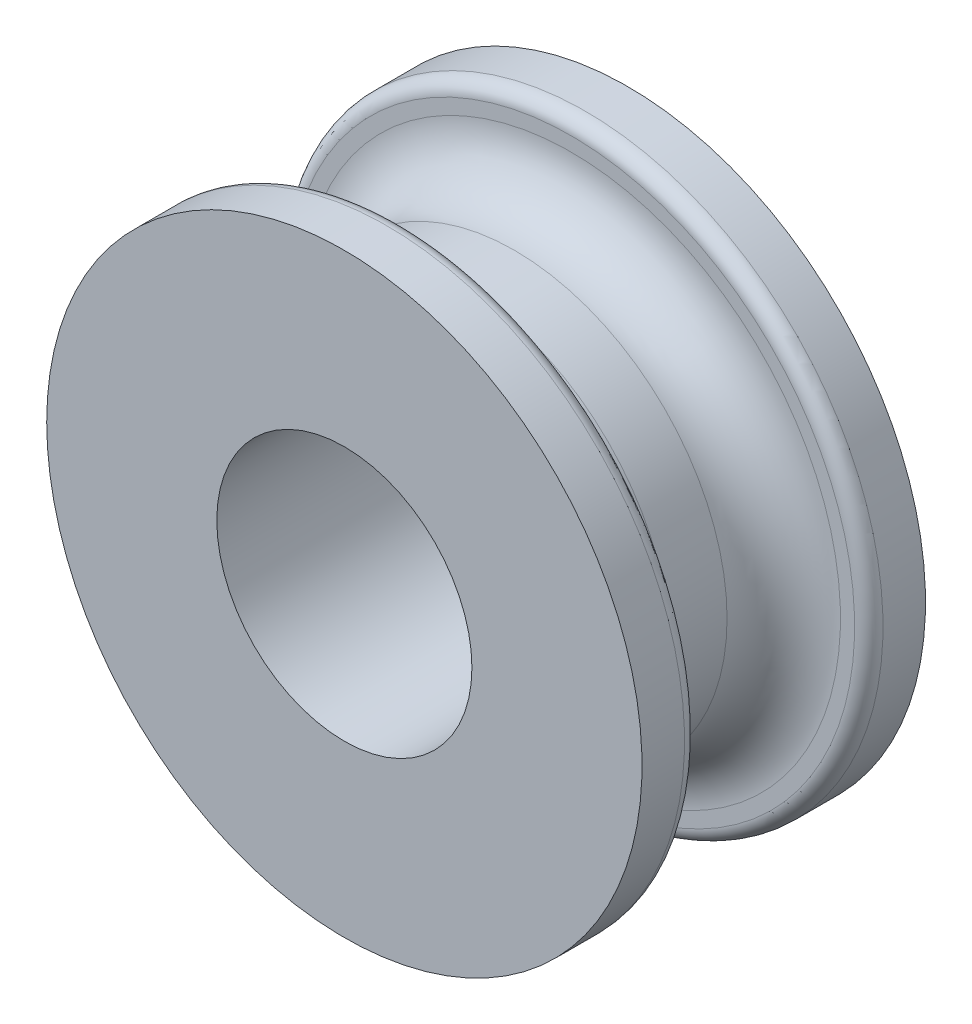
ISO-10303-21;
HEADER;
FILE_DESCRIPTION(('STEP AP214'),'2;1');
FILE_NAME('part.step','',(''),(''),'','','');
FILE_SCHEMA(('AUTOMOTIVE_DESIGN { 1 0 10303 214 1 1 1 1 }'));
ENDSEC;
DATA;
#1=APPLICATION_CONTEXT('core data for automotive mechanical design processes');
#2=APPLICATION_PROTOCOL_DEFINITION('international standard','automotive_design',2000,#1);
#3=PRODUCT_CONTEXT('',#1,'mechanical');
#4=PRODUCT('Part','Part','',(#3));
#5=PRODUCT_RELATED_PRODUCT_CATEGORY('part','',(#4));
#6=PRODUCT_DEFINITION_FORMATION('','',#4);
#7=PRODUCT_DEFINITION_CONTEXT('part definition',#1,'design');
#8=PRODUCT_DEFINITION('design','',#6,#7);
#9=PRODUCT_DEFINITION_SHAPE('','',#8);
#10=(LENGTH_UNIT() NAMED_UNIT(*) SI_UNIT(.MILLI.,.METRE.));
#11=(NAMED_UNIT(*) PLANE_ANGLE_UNIT() SI_UNIT($,.RADIAN.));
#12=(NAMED_UNIT(*) SI_UNIT($,.STERADIAN.) SOLID_ANGLE_UNIT());
#13=UNCERTAINTY_MEASURE_WITH_UNIT(LENGTH_MEASURE(1.E-05),#10,'distance_accuracy_value','');
#14=(GEOMETRIC_REPRESENTATION_CONTEXT(3) GLOBAL_UNCERTAINTY_ASSIGNED_CONTEXT((#13)) GLOBAL_UNIT_ASSIGNED_CONTEXT((#10,
#11,#12)) REPRESENTATION_CONTEXT('',''));
#15=CARTESIAN_POINT('',(0.,0.,0.));
#16=DIRECTION('',(0.,0.,1.));
#17=DIRECTION('',(1.,0.,0.));
#18=AXIS2_PLACEMENT_3D('',#15,#16,#17);
#19=CARTESIAN_POINT('',(0.,0.,-10.));
#20=DIRECTION('',(0.,0.,-1.));
#21=DIRECTION('',(-1.,0.,0.));
#22=AXIS2_PLACEMENT_3D('',#19,#20,#21);
#23=CYLINDRICAL_SURFACE('',#22,4.5);
#24=CARTESIAN_POINT('',(0.,0.,0.));
#25=DIRECTION('',(0.,0.,-1.));
#26=DIRECTION('',(-1.,0.,0.));
#27=AXIS2_PLACEMENT_3D('',#24,#25,#26);
#28=CIRCLE('',#27,4.5);
#29=CARTESIAN_POINT('',(-4.5,0.,0.));
#30=VERTEX_POINT('',#29);
#31=EDGE_CURVE('E10',#30,#30,#28,.T.);
#32=ORIENTED_EDGE('',*,*,#31,.F.);
#33=EDGE_LOOP('',(#32));
#34=FACE_BOUND('',#33,.T.);
#35=CARTESIAN_POINT('',(0.,0.,-10.));
#36=DIRECTION('',(0.,0.,-1.));
#37=DIRECTION('',(-1.,0.,0.));
#38=AXIS2_PLACEMENT_3D('',#35,#36,#37);
#39=CIRCLE('',#38,4.5);
#40=CARTESIAN_POINT('',(-4.5,0.,-10.));
#41=VERTEX_POINT('',#40);
#42=EDGE_CURVE('E88',#41,#41,#39,.T.);
#43=ORIENTED_EDGE('',*,*,#42,.T.);
#44=EDGE_LOOP('',(#43));
#45=FACE_BOUND('',#44,.T.);
#46=ADVANCED_FACE('F37',(#34,#45),#23,.F.);
#47=CARTESIAN_POINT('',(4.5,0.,0.));
#48=DIRECTION('',(0.,0.,-1.));
#49=DIRECTION('',(-1.,0.,0.));
#50=AXIS2_PLACEMENT_3D('',#47,#48,#49);
#51=PLANE('',#50);
#52=CARTESIAN_POINT('',(0.,0.,0.));
#53=DIRECTION('',(0.,0.,-1.));
#54=DIRECTION('',(-1.,0.,0.));
#55=AXIS2_PLACEMENT_3D('',#52,#53,#54);
#56=CIRCLE('',#55,10.5);
#57=CARTESIAN_POINT('',(-10.5,0.,0.));
#58=VERTEX_POINT('',#57);
#59=EDGE_CURVE('E44',#58,#58,#56,.T.);
#60=ORIENTED_EDGE('',*,*,#59,.F.);
#61=EDGE_LOOP('',(#60));
#62=FACE_BOUND('',#61,.T.);
#63=ORIENTED_EDGE('',*,*,#31,.T.);
#64=EDGE_LOOP('',(#63));
#65=FACE_BOUND('',#64,.T.);
#66=ADVANCED_FACE('F150',(#62,#65),#51,.F.);
#67=CARTESIAN_POINT('',(0.,0.,-10.));
#68=DIRECTION('',(0.,0.,-1.));
#69=DIRECTION('',(-1.,0.,0.));
#70=AXIS2_PLACEMENT_3D('',#67,#68,#69);
#71=CYLINDRICAL_SURFACE('',#70,10.5);
#72=CARTESIAN_POINT('',(0.,0.,-1.5));
#73=DIRECTION('',(0.,0.,-1.));
#74=DIRECTION('',(-1.,0.,0.));
#75=AXIS2_PLACEMENT_3D('',#72,#73,#74);
#76=CIRCLE('',#75,10.5);
#77=CARTESIAN_POINT('',(-10.5,0.,-1.5));
#78=VERTEX_POINT('',#77);
#79=EDGE_CURVE('E49',#78,#78,#76,.T.);
#80=ORIENTED_EDGE('',*,*,#79,.F.);
#81=EDGE_LOOP('',(#80));
#82=FACE_BOUND('',#81,.T.);
#83=ORIENTED_EDGE('',*,*,#59,.T.);
#84=EDGE_LOOP('',(#83));
#85=FACE_BOUND('',#84,.T.);
#86=ADVANCED_FACE('F145',(#82,#85),#71,.T.);
#87=CARTESIAN_POINT('',(0.,0.,-1.5));
#88=DIRECTION('',(0.,0.,-1.));
#89=DIRECTION('',(-1.,0.,0.));
#90=AXIS2_PLACEMENT_3D('',#87,#88,#89);
#91=TOROIDAL_SURFACE('',#90,10.,0.500000000000001);
#92=CARTESIAN_POINT('',(0.,0.,-2.));
#93=DIRECTION('',(0.,0.,-1.));
#94=DIRECTION('',(-1.,0.,0.));
#95=AXIS2_PLACEMENT_3D('',#92,#93,#94);
#96=CIRCLE('',#95,10.);
#97=CARTESIAN_POINT('',(-10.,0.,-2.));
#98=VERTEX_POINT('',#97);
#99=EDGE_CURVE('E54',#98,#98,#96,.T.);
#100=ORIENTED_EDGE('',*,*,#99,.F.);
#101=EDGE_LOOP('',(#100));
#102=FACE_BOUND('',#101,.T.);
#103=ORIENTED_EDGE('',*,*,#79,.T.);
#104=EDGE_LOOP('',(#103));
#105=FACE_BOUND('',#104,.T.);
#106=ADVANCED_FACE('F139',(#102,#105),#91,.T.);
#107=CARTESIAN_POINT('',(10.,0.,-2.));
#108=DIRECTION('',(0.,0.,1.));
#109=DIRECTION('',(1.,0.,0.));
#110=AXIS2_PLACEMENT_3D('',#107,#108,#109);
#111=PLANE('',#110);
#112=CARTESIAN_POINT('',(0.,0.,-2.));
#113=DIRECTION('',(0.,0.,-1.));
#114=DIRECTION('',(-1.,0.,0.));
#115=AXIS2_PLACEMENT_3D('',#112,#113,#114);
#116=CIRCLE('',#115,9.5);
#117=CARTESIAN_POINT('',(-9.5,0.,-2.));
#118=VERTEX_POINT('',#117);
#119=EDGE_CURVE('E60',#118,#118,#116,.T.);
#120=ORIENTED_EDGE('',*,*,#119,.F.);
#121=EDGE_LOOP('',(#120));
#122=FACE_BOUND('',#121,.T.);
#123=ORIENTED_EDGE('',*,*,#99,.T.);
#124=EDGE_LOOP('',(#123));
#125=FACE_BOUND('',#124,.T.);
#126=ADVANCED_FACE('F133',(#122,#125),#111,.F.);
#127=CARTESIAN_POINT('',(0.,0.,-4.));
#128=DIRECTION('',(0.,0.,-1.));
#129=DIRECTION('',(-1.,0.,0.));
#130=AXIS2_PLACEMENT_3D('',#127,#128,#129);
#131=TOROIDAL_SURFACE('',#130,9.5,2.);
#132=CARTESIAN_POINT('',(0.,0.,-4.));
#133=DIRECTION('',(0.,0.,-1.));
#134=DIRECTION('',(-1.,0.,0.));
#135=AXIS2_PLACEMENT_3D('',#132,#133,#134);
#136=CIRCLE('',#135,7.5);
#137=CARTESIAN_POINT('',(-7.5,0.,-4.));
#138=VERTEX_POINT('',#137);
#139=EDGE_CURVE('E64',#138,#138,#136,.T.);
#140=ORIENTED_EDGE('',*,*,#139,.F.);
#141=EDGE_LOOP('',(#140));
#142=FACE_BOUND('',#141,.T.);
#143=ORIENTED_EDGE('',*,*,#119,.T.);
#144=EDGE_LOOP('',(#143));
#145=FACE_BOUND('',#144,.T.);
#146=ADVANCED_FACE('F127',(#142,#145),#131,.F.);
#147=CARTESIAN_POINT('',(0.,0.,-10.));
#148=DIRECTION('',(0.,0.,-1.));
#149=DIRECTION('',(-1.,0.,0.));
#150=AXIS2_PLACEMENT_3D('',#147,#148,#149);
#151=CYLINDRICAL_SURFACE('',#150,7.5);
#152=CARTESIAN_POINT('',(0.,0.,-6.));
#153=DIRECTION('',(0.,0.,-1.));
#154=DIRECTION('',(-1.,0.,0.));
#155=AXIS2_PLACEMENT_3D('',#152,#153,#154);
#156=CIRCLE('',#155,7.5);
#157=CARTESIAN_POINT('',(-7.5,0.,-6.));
#158=VERTEX_POINT('',#157);
#159=EDGE_CURVE('E68',#158,#158,#156,.T.);
#160=ORIENTED_EDGE('',*,*,#159,.F.);
#161=EDGE_LOOP('',(#160));
#162=FACE_BOUND('',#161,.T.);
#163=ORIENTED_EDGE('',*,*,#139,.T.);
#164=EDGE_LOOP('',(#163));
#165=FACE_BOUND('',#164,.T.);
#166=ADVANCED_FACE('F121',(#162,#165),#151,.T.);
#167=CARTESIAN_POINT('',(0.,0.,-6.));
#168=DIRECTION('',(0.,0.,-1.));
#169=DIRECTION('',(-1.,0.,0.));
#170=AXIS2_PLACEMENT_3D('',#167,#168,#169);
#171=TOROIDAL_SURFACE('',#170,9.5,2.);
#172=CARTESIAN_POINT('',(0.,0.,-8.));
#173=DIRECTION('',(0.,0.,-1.));
#174=DIRECTION('',(-1.,0.,0.));
#175=AXIS2_PLACEMENT_3D('',#172,#173,#174);
#176=CIRCLE('',#175,9.5);
#177=CARTESIAN_POINT('',(-9.5,0.,-8.));
#178=VERTEX_POINT('',#177);
#179=EDGE_CURVE('E72',#178,#178,#176,.T.);
#180=ORIENTED_EDGE('',*,*,#179,.F.);
#181=EDGE_LOOP('',(#180));
#182=FACE_BOUND('',#181,.T.);
#183=ORIENTED_EDGE('',*,*,#159,.T.);
#184=EDGE_LOOP('',(#183));
#185=FACE_BOUND('',#184,.T.);
#186=ADVANCED_FACE('F115',(#182,#185),#171,.F.);
#187=CARTESIAN_POINT('',(9.5,0.,-8.));
#188=DIRECTION('',(0.,0.,-1.));
#189=DIRECTION('',(-1.,0.,0.));
#190=AXIS2_PLACEMENT_3D('',#187,#188,#189);
#191=PLANE('',#190);
#192=CARTESIAN_POINT('',(0.,0.,-8.));
#193=DIRECTION('',(0.,0.,-1.));
#194=DIRECTION('',(-1.,0.,0.));
#195=AXIS2_PLACEMENT_3D('',#192,#193,#194);
#196=CIRCLE('',#195,10.);
#197=CARTESIAN_POINT('',(-10.,0.,-8.));
#198=VERTEX_POINT('',#197);
#199=EDGE_CURVE('E76',#198,#198,#196,.T.);
#200=ORIENTED_EDGE('',*,*,#199,.F.);
#201=EDGE_LOOP('',(#200));
#202=FACE_BOUND('',#201,.T.);
#203=ORIENTED_EDGE('',*,*,#179,.T.);
#204=EDGE_LOOP('',(#203));
#205=FACE_BOUND('',#204,.T.);
#206=ADVANCED_FACE('F109',(#202,#205),#191,.F.);
#207=CARTESIAN_POINT('',(0.,0.,-8.5));
#208=DIRECTION('',(0.,0.,-1.));
#209=DIRECTION('',(-1.,0.,0.));
#210=AXIS2_PLACEMENT_3D('',#207,#208,#209);
#211=TOROIDAL_SURFACE('',#210,10.,0.5);
#212=CARTESIAN_POINT('',(0.,0.,-8.5));
#213=DIRECTION('',(0.,0.,-1.));
#214=DIRECTION('',(-1.,0.,0.));
#215=AXIS2_PLACEMENT_3D('',#212,#213,#214);
#216=CIRCLE('',#215,10.5);
#217=CARTESIAN_POINT('',(-10.5,0.,-8.5));
#218=VERTEX_POINT('',#217);
#219=EDGE_CURVE('E80',#218,#218,#216,.T.);
#220=ORIENTED_EDGE('',*,*,#219,.F.);
#221=EDGE_LOOP('',(#220));
#222=FACE_BOUND('',#221,.T.);
#223=ORIENTED_EDGE('',*,*,#199,.T.);
#224=EDGE_LOOP('',(#223));
#225=FACE_BOUND('',#224,.T.);
#226=ADVANCED_FACE('F103',(#222,#225),#211,.T.);
#227=CARTESIAN_POINT('',(0.,0.,-10.));
#228=DIRECTION('',(0.,0.,-1.));
#229=DIRECTION('',(-1.,0.,0.));
#230=AXIS2_PLACEMENT_3D('',#227,#228,#229);
#231=CYLINDRICAL_SURFACE('',#230,10.5);
#232=CARTESIAN_POINT('',(0.,0.,-10.));
#233=DIRECTION('',(0.,0.,-1.));
#234=DIRECTION('',(-1.,0.,0.));
#235=AXIS2_PLACEMENT_3D('',#232,#233,#234);
#236=CIRCLE('',#235,10.5);
#237=CARTESIAN_POINT('',(-10.5,0.,-10.));
#238=VERTEX_POINT('',#237);
#239=EDGE_CURVE('E84',#238,#238,#236,.T.);
#240=ORIENTED_EDGE('',*,*,#239,.F.);
#241=EDGE_LOOP('',(#240));
#242=FACE_BOUND('',#241,.T.);
#243=ORIENTED_EDGE('',*,*,#219,.T.);
#244=EDGE_LOOP('',(#243));
#245=FACE_BOUND('',#244,.T.);
#246=ADVANCED_FACE('F97',(#242,#245),#231,.T.);
#247=CARTESIAN_POINT('',(10.5,0.,-10.));
#248=DIRECTION('',(0.,0.,1.));
#249=DIRECTION('',(1.,0.,0.));
#250=AXIS2_PLACEMENT_3D('',#247,#248,#249);
#251=PLANE('',#250);
#252=ORIENTED_EDGE('',*,*,#42,.F.);
#253=EDGE_LOOP('',(#252));
#254=FACE_BOUND('',#253,.T.);
#255=ORIENTED_EDGE('',*,*,#239,.T.);
#256=EDGE_LOOP('',(#255));
#257=FACE_BOUND('',#256,.T.);
#258=ADVANCED_FACE('F94',(#254,#257),#251,.F.);
#259=CLOSED_SHELL('',(#46,#66,#86,#106,#126,#146,#166,#186,#206,#226,#246,#258));
#260=MANIFOLD_SOLID_BREP('B2',#259);
#261=ADVANCED_BREP_SHAPE_REPRESENTATION('',(#18,#260),#14);
#262=SHAPE_DEFINITION_REPRESENTATION(#9,#261);
ENDSEC;
END-ISO-10303-21;
